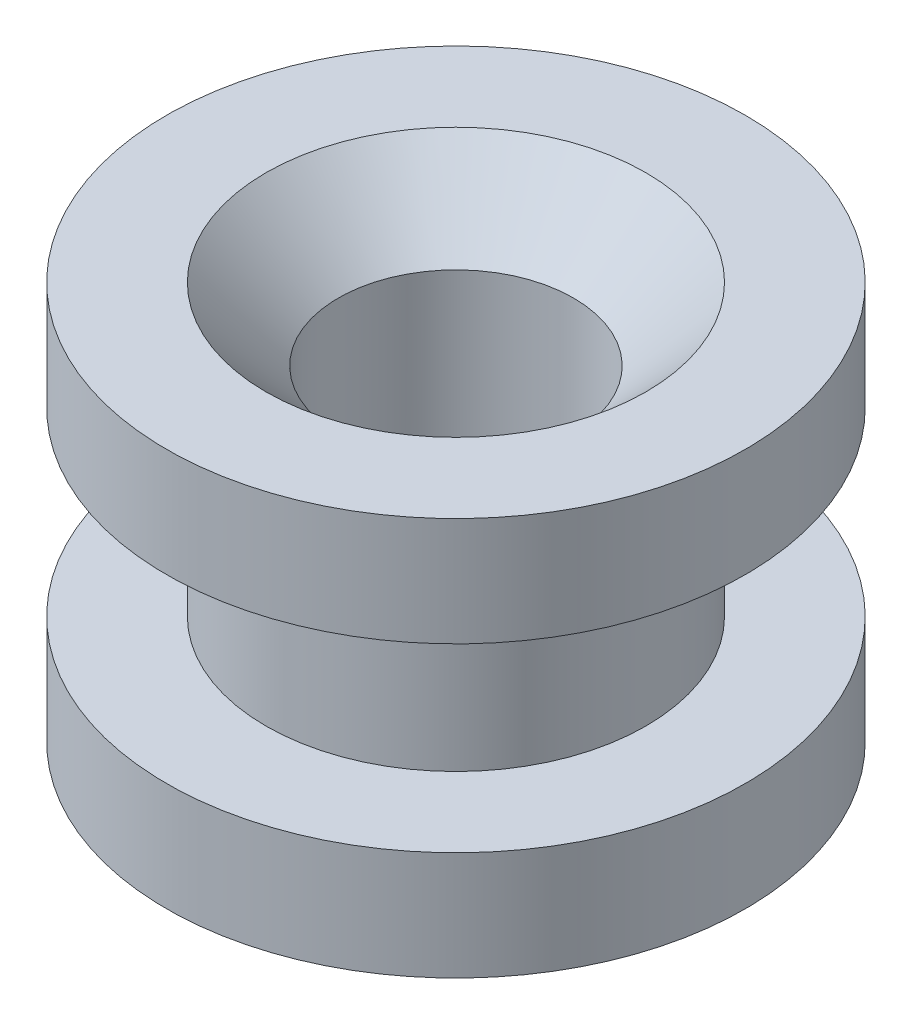
ISO-10303-21;
HEADER;
FILE_DESCRIPTION(('STEP AP214'),'2;1');
FILE_NAME('part.step','',(''),(''),'','','');
FILE_SCHEMA(('AUTOMOTIVE_DESIGN { 1 0 10303 214 1 1 1 1 }'));
ENDSEC;
DATA;
#1=APPLICATION_CONTEXT('core data for automotive mechanical design processes');
#2=APPLICATION_PROTOCOL_DEFINITION('international standard','automotive_design',2000,#1);
#3=PRODUCT_CONTEXT('',#1,'mechanical');
#4=PRODUCT('Part','Part','',(#3));
#5=PRODUCT_RELATED_PRODUCT_CATEGORY('part','',(#4));
#6=PRODUCT_DEFINITION_FORMATION('','',#4);
#7=PRODUCT_DEFINITION_CONTEXT('part definition',#1,'design');
#8=PRODUCT_DEFINITION('design','',#6,#7);
#9=PRODUCT_DEFINITION_SHAPE('','',#8);
#10=(LENGTH_UNIT() NAMED_UNIT(*) SI_UNIT(.MILLI.,.METRE.));
#11=(NAMED_UNIT(*) PLANE_ANGLE_UNIT() SI_UNIT($,.RADIAN.));
#12=(NAMED_UNIT(*) SI_UNIT($,.STERADIAN.) SOLID_ANGLE_UNIT());
#13=UNCERTAINTY_MEASURE_WITH_UNIT(LENGTH_MEASURE(1.E-05),#10,'distance_accuracy_value','');
#14=(GEOMETRIC_REPRESENTATION_CONTEXT(3) GLOBAL_UNCERTAINTY_ASSIGNED_CONTEXT((#13)) GLOBAL_UNIT_ASSIGNED_CONTEXT((#10,
#11,#12)) REPRESENTATION_CONTEXT('',''));
#15=CARTESIAN_POINT('',(0.,0.,0.));
#16=DIRECTION('',(0.,0.,1.));
#17=DIRECTION('',(1.,0.,0.));
#18=AXIS2_PLACEMENT_3D('',#15,#16,#17);
#19=CARTESIAN_POINT('',(8.,0.,0.));
#20=DIRECTION('',(0.,-1.,0.));
#21=DIRECTION('',(0.,0.,-1.));
#22=AXIS2_PLACEMENT_3D('',#19,#20,#21);
#23=PLANE('',#22);
#24=CARTESIAN_POINT('',(0.,0.,0.));
#25=DIRECTION('',(0.,-1.,0.));
#26=DIRECTION('',(0.,0.,-1.));
#27=AXIS2_PLACEMENT_3D('',#24,#25,#26);
#28=CIRCLE('',#27,5.25);
#29=CARTESIAN_POINT('',(0.,0.,-5.25));
#30=VERTEX_POINT('',#29);
#31=EDGE_CURVE('E45',#30,#30,#28,.F.);
#32=ORIENTED_EDGE('',*,*,#31,.T.);
#33=EDGE_LOOP('',(#32));
#34=FACE_BOUND('',#33,.T.);
#35=CARTESIAN_POINT('',(0.,0.,0.));
#36=DIRECTION('',(0.,-1.,0.));
#37=DIRECTION('',(0.,0.,-1.));
#38=AXIS2_PLACEMENT_3D('',#35,#36,#37);
#39=CIRCLE('',#38,8.);
#40=CARTESIAN_POINT('',(0.,0.,-8.));
#41=VERTEX_POINT('',#40);
#42=EDGE_CURVE('E75',#41,#41,#39,.T.);
#43=ORIENTED_EDGE('',*,*,#42,.T.);
#44=EDGE_LOOP('',(#43));
#45=FACE_BOUND('',#44,.T.);
#46=ADVANCED_FACE('F37',(#34,#45),#23,.T.);
#47=CARTESIAN_POINT('',(0.,0.,0.));
#48=DIRECTION('',(0.,-1.,0.));
#49=DIRECTION('',(0.,0.,-1.));
#50=AXIS2_PLACEMENT_3D('',#47,#48,#49);
#51=CYLINDRICAL_SURFACE('',#50,3.25);
#52=CARTESIAN_POINT('',(0.,2.00000000000001,0.));
#53=DIRECTION('',(0.,-1.,0.));
#54=DIRECTION('',(0.,0.,-1.));
#55=AXIS2_PLACEMENT_3D('',#52,#53,#54);
#56=CIRCLE('',#55,3.25);
#57=CARTESIAN_POINT('',(0.,2.00000000000001,-3.25));
#58=VERTEX_POINT('',#57);
#59=EDGE_CURVE('E49',#58,#58,#56,.T.);
#60=ORIENTED_EDGE('',*,*,#59,.T.);
#61=EDGE_LOOP('',(#60));
#62=FACE_BOUND('',#61,.T.);
#63=CARTESIAN_POINT('',(0.,9.,0.));
#64=DIRECTION('',(0.,1.,0.));
#65=DIRECTION('',(0.,0.,1.));
#66=AXIS2_PLACEMENT_3D('',#63,#64,#65);
#67=CIRCLE('',#66,3.25);
#68=CARTESIAN_POINT('',(0.,9.,3.25));
#69=VERTEX_POINT('',#68);
#70=EDGE_CURVE('E53',#69,#69,#67,.T.);
#71=ORIENTED_EDGE('',*,*,#70,.T.);
#72=EDGE_LOOP('',(#71));
#73=FACE_BOUND('',#72,.T.);
#74=ADVANCED_FACE('F95',(#62,#73),#51,.F.);
#75=CARTESIAN_POINT('',(3.25,11.,0.));
#76=DIRECTION('',(0.,1.,0.));
#77=DIRECTION('',(0.,0.,1.));
#78=AXIS2_PLACEMENT_3D('',#75,#76,#77);
#79=PLANE('',#78);
#80=CARTESIAN_POINT('',(0.,11.,0.));
#81=DIRECTION('',(0.,1.,0.));
#82=DIRECTION('',(0.,0.,1.));
#83=AXIS2_PLACEMENT_3D('',#80,#81,#82);
#84=CIRCLE('',#83,5.24999999999999);
#85=CARTESIAN_POINT('',(0.,11.,5.24999999999999));
#86=VERTEX_POINT('',#85);
#87=EDGE_CURVE('E10',#86,#86,#84,.F.);
#88=ORIENTED_EDGE('',*,*,#87,.T.);
#89=EDGE_LOOP('',(#88));
#90=FACE_BOUND('',#89,.T.);
#91=CARTESIAN_POINT('',(0.,11.,0.));
#92=DIRECTION('',(0.,-1.,0.));
#93=DIRECTION('',(0.,0.,-1.));
#94=AXIS2_PLACEMENT_3D('',#91,#92,#93);
#95=CIRCLE('',#94,8.);
#96=CARTESIAN_POINT('',(0.,11.,-8.));
#97=VERTEX_POINT('',#96);
#98=EDGE_CURVE('E58',#97,#97,#95,.T.);
#99=ORIENTED_EDGE('',*,*,#98,.F.);
#100=EDGE_LOOP('',(#99));
#101=FACE_BOUND('',#100,.T.);
#102=ADVANCED_FACE('F100',(#90,#101),#79,.T.);
#103=CARTESIAN_POINT('',(0.,0.,0.));
#104=DIRECTION('',(0.,-1.,0.));
#105=DIRECTION('',(0.,0.,-1.));
#106=AXIS2_PLACEMENT_3D('',#103,#104,#105);
#107=CYLINDRICAL_SURFACE('',#106,8.);
#108=ORIENTED_EDGE('',*,*,#98,.T.);
#109=EDGE_LOOP('',(#108));
#110=FACE_BOUND('',#109,.T.);
#111=CARTESIAN_POINT('',(0.,8.,0.));
#112=DIRECTION('',(0.,-1.,0.));
#113=DIRECTION('',(0.,0.,-1.));
#114=AXIS2_PLACEMENT_3D('',#111,#112,#113);
#115=CIRCLE('',#114,8.);
#116=CARTESIAN_POINT('',(0.,8.,-8.));
#117=VERTEX_POINT('',#116);
#118=EDGE_CURVE('E62',#117,#117,#115,.T.);
#119=ORIENTED_EDGE('',*,*,#118,.F.);
#120=EDGE_LOOP('',(#119));
#121=FACE_BOUND('',#120,.T.);
#122=ADVANCED_FACE('F111',(#110,#121),#107,.T.);
#123=CARTESIAN_POINT('',(8.,8.,0.));
#124=DIRECTION('',(0.,-1.,0.));
#125=DIRECTION('',(0.,0.,-1.));
#126=AXIS2_PLACEMENT_3D('',#123,#124,#125);
#127=PLANE('',#126);
#128=ORIENTED_EDGE('',*,*,#118,.T.);
#129=EDGE_LOOP('',(#128));
#130=FACE_BOUND('',#129,.T.);
#131=CARTESIAN_POINT('',(0.,8.,0.));
#132=DIRECTION('',(0.,-1.,0.));
#133=DIRECTION('',(0.,0.,-1.));
#134=AXIS2_PLACEMENT_3D('',#131,#132,#133);
#135=CIRCLE('',#134,5.25);
#136=CARTESIAN_POINT('',(0.,8.,-5.25));
#137=VERTEX_POINT('',#136);
#138=EDGE_CURVE('E66',#137,#137,#135,.T.);
#139=ORIENTED_EDGE('',*,*,#138,.F.);
#140=EDGE_LOOP('',(#139));
#141=FACE_BOUND('',#140,.T.);
#142=ADVANCED_FACE('F114',(#130,#141),#127,.T.);
#143=CARTESIAN_POINT('',(0.,0.,0.));
#144=DIRECTION('',(0.,-1.,0.));
#145=DIRECTION('',(0.,0.,-1.));
#146=AXIS2_PLACEMENT_3D('',#143,#144,#145);
#147=CYLINDRICAL_SURFACE('',#146,5.25);
#148=ORIENTED_EDGE('',*,*,#138,.T.);
#149=EDGE_LOOP('',(#148));
#150=FACE_BOUND('',#149,.T.);
#151=CARTESIAN_POINT('',(0.,3.,0.));
#152=DIRECTION('',(0.,-1.,0.));
#153=DIRECTION('',(0.,0.,-1.));
#154=AXIS2_PLACEMENT_3D('',#151,#152,#153);
#155=CIRCLE('',#154,5.25);
#156=CARTESIAN_POINT('',(0.,3.,-5.25));
#157=VERTEX_POINT('',#156);
#158=EDGE_CURVE('E69',#157,#157,#155,.T.);
#159=ORIENTED_EDGE('',*,*,#158,.F.);
#160=EDGE_LOOP('',(#159));
#161=FACE_BOUND('',#160,.T.);
#162=ADVANCED_FACE('F91',(#150,#161),#147,.T.);
#163=CARTESIAN_POINT('',(5.25,3.,0.));
#164=DIRECTION('',(0.,1.,0.));
#165=DIRECTION('',(0.,0.,1.));
#166=AXIS2_PLACEMENT_3D('',#163,#164,#165);
#167=PLANE('',#166);
#168=ORIENTED_EDGE('',*,*,#158,.T.);
#169=EDGE_LOOP('',(#168));
#170=FACE_BOUND('',#169,.T.);
#171=CARTESIAN_POINT('',(0.,3.,0.));
#172=DIRECTION('',(0.,-1.,0.));
#173=DIRECTION('',(0.,0.,-1.));
#174=AXIS2_PLACEMENT_3D('',#171,#172,#173);
#175=CIRCLE('',#174,8.);
#176=CARTESIAN_POINT('',(0.,3.,-8.));
#177=VERTEX_POINT('',#176);
#178=EDGE_CURVE('E72',#177,#177,#175,.T.);
#179=ORIENTED_EDGE('',*,*,#178,.F.);
#180=EDGE_LOOP('',(#179));
#181=FACE_BOUND('',#180,.T.);
#182=ADVANCED_FACE('F83',(#170,#181),#167,.T.);
#183=CARTESIAN_POINT('',(0.,0.,0.));
#184=DIRECTION('',(0.,-1.,0.));
#185=DIRECTION('',(0.,0.,-1.));
#186=AXIS2_PLACEMENT_3D('',#183,#184,#185);
#187=CYLINDRICAL_SURFACE('',#186,8.);
#188=ORIENTED_EDGE('',*,*,#178,.T.);
#189=EDGE_LOOP('',(#188));
#190=FACE_BOUND('',#189,.T.);
#191=ORIENTED_EDGE('',*,*,#42,.F.);
#192=EDGE_LOOP('',(#191));
#193=FACE_BOUND('',#192,.T.);
#194=ADVANCED_FACE('F80',(#190,#193),#187,.T.);
#195=CARTESIAN_POINT('',(0.,2.00000000000001,0.));
#196=DIRECTION('',(0.,-1.,0.));
#197=DIRECTION('',(0.,0.,-1.));
#198=AXIS2_PLACEMENT_3D('',#195,#196,#197);
#199=CONICAL_SURFACE('',#198,3.25,0.785398163397446);
#200=ORIENTED_EDGE('',*,*,#31,.F.);
#201=EDGE_LOOP('',(#200));
#202=FACE_BOUND('',#201,.T.);
#203=ORIENTED_EDGE('',*,*,#59,.F.);
#204=EDGE_LOOP('',(#203));
#205=FACE_BOUND('',#204,.T.);
#206=ADVANCED_FACE('F82',(#202,#205),#199,.F.);
#207=CARTESIAN_POINT('',(0.,11.,0.));
#208=DIRECTION('',(0.,1.,0.));
#209=DIRECTION('',(0.,0.,1.));
#210=AXIS2_PLACEMENT_3D('',#207,#208,#209);
#211=CONICAL_SURFACE('',#210,5.24999999999999,0.785398163397446);
#212=ORIENTED_EDGE('',*,*,#70,.F.);
#213=EDGE_LOOP('',(#212));
#214=FACE_BOUND('',#213,.T.);
#215=ORIENTED_EDGE('',*,*,#87,.F.);
#216=EDGE_LOOP('',(#215));
#217=FACE_BOUND('',#216,.T.);
#218=ADVANCED_FACE('F40',(#214,#217),#211,.F.);
#219=CLOSED_SHELL('',(#46,#74,#102,#122,#142,#162,#182,#194,#206,#218));
#220=MANIFOLD_SOLID_BREP('B2',#219);
#221=ADVANCED_BREP_SHAPE_REPRESENTATION('',(#18,#220),#14);
#222=SHAPE_DEFINITION_REPRESENTATION(#9,#221);
ENDSEC;
END-ISO-10303-21;
